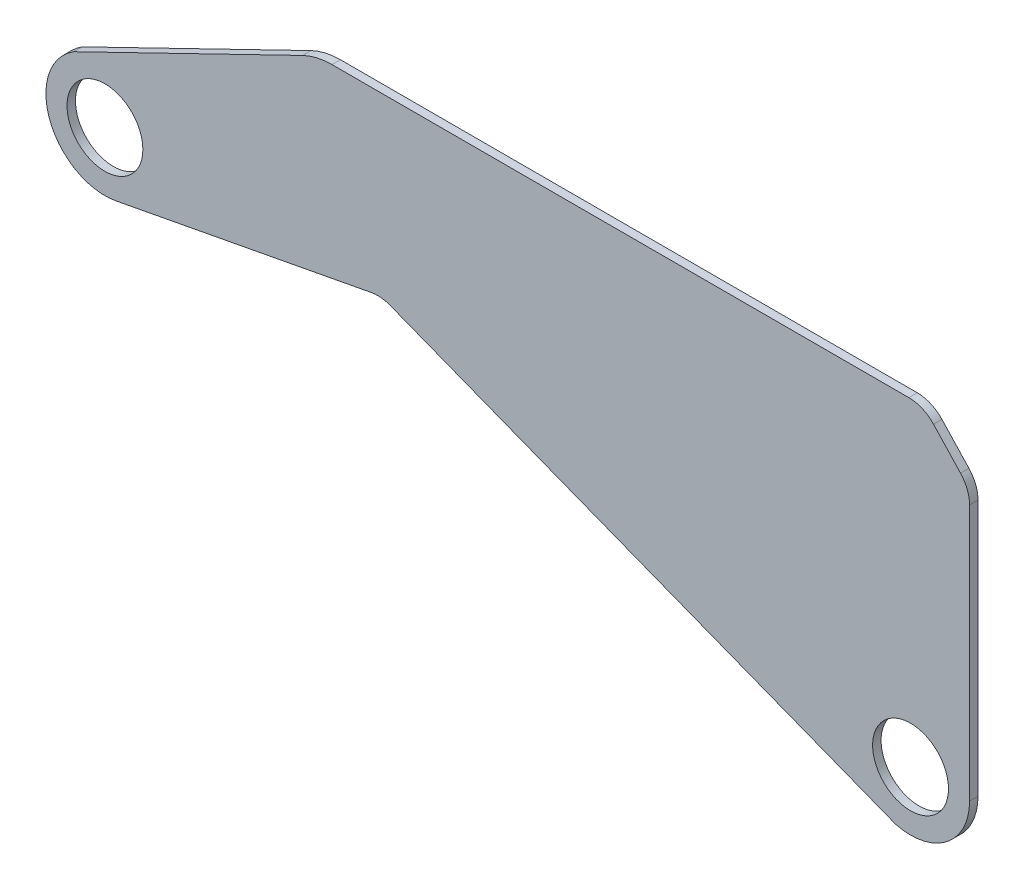
ISO-10303-21;
HEADER;
FILE_DESCRIPTION(('STEP AP214'),'2;1');
FILE_NAME('part.step','',(''),(''),'','','');
FILE_SCHEMA(('AUTOMOTIVE_DESIGN { 1 0 10303 214 1 1 1 1 }'));
ENDSEC;
DATA;
#1=APPLICATION_CONTEXT('core data for automotive mechanical design processes');
#2=APPLICATION_PROTOCOL_DEFINITION('international standard','automotive_design',2000,#1);
#3=PRODUCT_CONTEXT('',#1,'mechanical');
#4=PRODUCT('Part','Part','',(#3));
#5=PRODUCT_RELATED_PRODUCT_CATEGORY('part','',(#4));
#6=PRODUCT_DEFINITION_FORMATION('','',#4);
#7=PRODUCT_DEFINITION_CONTEXT('part definition',#1,'design');
#8=PRODUCT_DEFINITION('design','',#6,#7);
#9=PRODUCT_DEFINITION_SHAPE('','',#8);
#10=(LENGTH_UNIT() NAMED_UNIT(*) SI_UNIT(.MILLI.,.METRE.));
#11=(NAMED_UNIT(*) PLANE_ANGLE_UNIT() SI_UNIT($,.RADIAN.));
#12=(NAMED_UNIT(*) SI_UNIT($,.STERADIAN.) SOLID_ANGLE_UNIT());
#13=UNCERTAINTY_MEASURE_WITH_UNIT(LENGTH_MEASURE(1.E-05),#10,'distance_accuracy_value','');
#14=(GEOMETRIC_REPRESENTATION_CONTEXT(3) GLOBAL_UNCERTAINTY_ASSIGNED_CONTEXT((#13)) GLOBAL_UNIT_ASSIGNED_CONTEXT((#10,
#11,#12)) REPRESENTATION_CONTEXT('',''));
#15=CARTESIAN_POINT('',(0.,0.,0.));
#16=DIRECTION('',(0.,0.,1.));
#17=DIRECTION('',(1.,0.,0.));
#18=AXIS2_PLACEMENT_3D('',#15,#16,#17);
#19=CARTESIAN_POINT('',(-89.9470010414896,185.144778833084,3.175));
#20=DIRECTION('',(0.436980758194094,-0.899470853873607,0.));
#21=DIRECTION('',(0.899470853873607,0.436980758194094,0.));
#22=AXIS2_PLACEMENT_3D('',#19,#20,#21);
#23=PLANE('',#22);
#24=DIRECTION('',(-0.899470853873607,-0.436980758194094,0.));
#25=VECTOR('',#24,1.);
#26=CARTESIAN_POINT('',(-89.9470010414896,185.144778833084,3.175));
#27=LINE('',#26,#25);
#28=CARTESIAN_POINT('',(-228.976859545876,117.601319565641,3.175));
#29=VERTEX_POINT('',#28);
#30=CARTESIAN_POINT('',(-315.107157175411,75.7575148447312,3.175));
#31=VERTEX_POINT('',#30);
#32=EDGE_CURVE('E131',#29,#31,#27,.T.);
#33=ORIENTED_EDGE('',*,*,#32,.F.);
#34=DIRECTION('',(0.,0.,-1.));
#35=VECTOR('',#34,1.);
#36=CARTESIAN_POINT('',(-228.976859545876,117.601319565641,3.175));
#37=LINE('',#36,#35);
#38=CARTESIAN_POINT('',(-228.976859545876,117.601319565641,0.));
#39=VERTEX_POINT('',#38);
#40=EDGE_CURVE('E171',#29,#39,#37,.T.);
#41=ORIENTED_EDGE('',*,*,#40,.T.);
#42=DIRECTION('',(-0.899470853873607,-0.436980758194094,0.));
#43=VECTOR('',#42,1.);
#44=CARTESIAN_POINT('',(-89.9470010414896,185.144778833084,0.));
#45=LINE('',#44,#43);
#46=CARTESIAN_POINT('',(-315.107157175411,75.7575148447312,0.));
#47=VERTEX_POINT('',#46);
#48=EDGE_CURVE('E155',#39,#47,#45,.T.);
#49=ORIENTED_EDGE('',*,*,#48,.T.);
#50=DIRECTION('',(0.,0.,-1.));
#51=VECTOR('',#50,1.);
#52=CARTESIAN_POINT('',(-315.107157175411,75.7575148447312,3.175));
#53=LINE('',#52,#51);
#54=EDGE_CURVE('E148',#31,#47,#53,.T.);
#55=ORIENTED_EDGE('',*,*,#54,.F.);
#56=EDGE_LOOP('',(#33,#41,#49,#55));
#57=FACE_BOUND('',#56,.T.);
#58=ADVANCED_FACE('F43',(#57),#23,.F.);
#59=CARTESIAN_POINT('',(-303.430444421185,56.8470678839822,3.175));
#60=DIRECTION('',(0.,0.,-1.));
#61=DIRECTION('',(-1.,0.,0.));
#62=AXIS2_PLACEMENT_3D('',#59,#60,#61);
#63=CYLINDRICAL_SURFACE('',#62,22.225);
#64=CARTESIAN_POINT('',(-303.430444421185,56.8470678839822,0.));
#65=DIRECTION('',(0.,0.,1.));
#66=DIRECTION('',(1.,0.,0.));
#67=AXIS2_PLACEMENT_3D('',#64,#65,#66);
#68=CIRCLE('',#67,22.225);
#69=CARTESIAN_POINT('',(-299.298978098127,35.0094487138108,0.));
#70=VERTEX_POINT('',#69);
#71=EDGE_CURVE('E234',#47,#70,#68,.T.);
#72=ORIENTED_EDGE('',*,*,#71,.T.);
#73=DIRECTION('',(0.,0.,-1.));
#74=VECTOR('',#73,1.);
#75=CARTESIAN_POINT('',(-299.298978098127,35.0094487138108,3.175));
#76=LINE('',#75,#74);
#77=CARTESIAN_POINT('',(-299.298978098127,35.0094487138108,3.175));
#78=VERTEX_POINT('',#77);
#79=EDGE_CURVE('E150',#78,#70,#76,.T.);
#80=ORIENTED_EDGE('',*,*,#79,.F.);
#81=CARTESIAN_POINT('',(-303.430444421185,56.8470678839822,3.175));
#82=DIRECTION('',(0.,0.,1.));
#83=DIRECTION('',(1.,0.,0.));
#84=AXIS2_PLACEMENT_3D('',#81,#82,#83);
#85=CIRCLE('',#84,22.225);
#86=EDGE_CURVE('E135',#31,#78,#85,.T.);
#87=ORIENTED_EDGE('',*,*,#86,.F.);
#88=ORIENTED_EDGE('',*,*,#54,.T.);
#89=EDGE_LOOP('',(#72,#80,#87,#88));
#90=FACE_BOUND('',#89,.T.);
#91=ADVANCED_FACE('F147',(#90),#63,.T.);
#92=CARTESIAN_POINT('',(-16.7371779379957,88.4674082306973,3.175));
#93=DIRECTION('',(-0.185892747944114,0.982570041402538,0.));
#94=DIRECTION('',(-0.982570041402539,-0.185892747944114,0.));
#95=AXIS2_PLACEMENT_3D('',#92,#93,#94);
#96=PLANE('',#95);
#97=DIRECTION('',(0.982570041402538,0.185892747944114,0.));
#98=VECTOR('',#97,1.);
#99=CARTESIAN_POINT('',(-16.7371779379957,88.4674082306973,0.));
#100=LINE('',#99,#98);
#101=CARTESIAN_POINT('',(-203.043765649032,53.2200038825454,0.));
#102=VERTEX_POINT('',#101);
#103=EDGE_CURVE('E229',#70,#102,#100,.T.);
#104=ORIENTED_EDGE('',*,*,#103,.T.);
#105=DIRECTION('',(0.,0.,-1.));
#106=VECTOR('',#105,1.);
#107=CARTESIAN_POINT('',(-203.043765649032,53.2200038825454,3.175));
#108=LINE('',#107,#106);
#109=CARTESIAN_POINT('',(-203.043765649032,53.2200038825454,3.175));
#110=VERTEX_POINT('',#109);
#111=EDGE_CURVE('E160',#102,#110,#108,.F.);
#112=ORIENTED_EDGE('',*,*,#111,.T.);
#113=DIRECTION('',(0.982570041402538,0.185892747944114,0.));
#114=VECTOR('',#113,1.);
#115=CARTESIAN_POINT('',(-16.7371779379957,88.4674082306973,3.175));
#116=LINE('',#115,#114);
#117=EDGE_CURVE('E152',#78,#110,#116,.T.);
#118=ORIENTED_EDGE('',*,*,#117,.F.);
#119=ORIENTED_EDGE('',*,*,#79,.T.);
#120=EDGE_LOOP('',(#104,#112,#118,#119));
#121=FACE_BOUND('',#120,.T.);
#122=ADVANCED_FACE('F279',(#121),#96,.F.);
#123=CARTESIAN_POINT('',(-7.99746861236985,-20.565009118134,3.175));
#124=DIRECTION('',(0.362444885945906,0.932005206343644,0.));
#125=DIRECTION('',(-0.932005206343644,0.362444885945906,0.));
#126=AXIS2_PLACEMENT_3D('',#123,#124,#125);
#127=PLANE('',#126);
#128=DIRECTION('',(0.932005206343644,-0.362444885945906,0.));
#129=VECTOR('',#128,1.);
#130=CARTESIAN_POINT('',(-7.99746861236985,-20.565009118134,3.175));
#131=LINE('',#130,#129);
#132=CARTESIAN_POINT('',(-196.079877698628,52.5778304772975,3.175));
#133=VERTEX_POINT('',#132);
#134=CARTESIAN_POINT('',(-5.51904950337745,-21.5288345615658,3.175));
#135=VERTEX_POINT('',#134);
#136=EDGE_CURVE('E250',#133,#135,#131,.T.);
#137=ORIENTED_EDGE('',*,*,#136,.F.);
#138=DIRECTION('',(0.,0.,-1.));
#139=VECTOR('',#138,1.);
#140=CARTESIAN_POINT('',(-196.079877698628,52.5778304772975,0.));
#141=LINE('',#140,#139);
#142=CARTESIAN_POINT('',(-196.079877698628,52.5778304772975,0.));
#143=VERTEX_POINT('',#142);
#144=EDGE_CURVE('E157',#133,#143,#141,.T.);
#145=ORIENTED_EDGE('',*,*,#144,.T.);
#146=DIRECTION('',(0.932005206343644,-0.362444885945906,0.));
#147=VECTOR('',#146,1.);
#148=CARTESIAN_POINT('',(-7.99746861236985,-20.565009118134,0.));
#149=LINE('',#148,#147);
#150=CARTESIAN_POINT('',(-5.51904950337745,-21.5288345615658,0.));
#151=VERTEX_POINT('',#150);
#152=EDGE_CURVE('E226',#143,#151,#149,.T.);
#153=ORIENTED_EDGE('',*,*,#152,.T.);
#154=DIRECTION('',(0.,0.,-1.));
#155=VECTOR('',#154,1.);
#156=CARTESIAN_POINT('',(-5.51904950337745,-21.5288345615658,3.175));
#157=LINE('',#156,#155);
#158=EDGE_CURVE('E162',#135,#151,#157,.T.);
#159=ORIENTED_EDGE('',*,*,#158,.F.);
#160=EDGE_LOOP('',(#137,#145,#153,#159));
#161=FACE_BOUND('',#160,.T.);
#162=ADVANCED_FACE('F312',(#161),#127,.F.);
#163=CARTESIAN_POINT('',(0.,0.,3.175));
#164=DIRECTION('',(0.,0.,-1.));
#165=DIRECTION('',(-1.,0.,0.));
#166=AXIS2_PLACEMENT_3D('',#163,#164,#165);
#167=CYLINDRICAL_SURFACE('',#166,22.225);
#168=CARTESIAN_POINT('',(0.,0.,0.));
#169=DIRECTION('',(0.,0.,1.));
#170=DIRECTION('',(1.,0.,0.));
#171=AXIS2_PLACEMENT_3D('',#168,#169,#170);
#172=CIRCLE('',#171,22.225);
#173=CARTESIAN_POINT('',(22.225,0.,0.));
#174=VERTEX_POINT('',#173);
#175=EDGE_CURVE('E220',#151,#174,#172,.T.);
#176=ORIENTED_EDGE('',*,*,#175,.T.);
#177=DIRECTION('',(0.,0.,-1.));
#178=VECTOR('',#177,1.);
#179=CARTESIAN_POINT('',(22.225,0.,3.175));
#180=LINE('',#179,#178);
#181=CARTESIAN_POINT('',(22.225,0.,3.175));
#182=VERTEX_POINT('',#181);
#183=EDGE_CURVE('E211',#182,#174,#180,.T.);
#184=ORIENTED_EDGE('',*,*,#183,.F.);
#185=CARTESIAN_POINT('',(0.,0.,3.175));
#186=DIRECTION('',(0.,0.,1.));
#187=DIRECTION('',(1.,0.,0.));
#188=AXIS2_PLACEMENT_3D('',#185,#186,#187);
#189=CIRCLE('',#188,22.225);
#190=EDGE_CURVE('E221',#135,#182,#189,.T.);
#191=ORIENTED_EDGE('',*,*,#190,.F.);
#192=ORIENTED_EDGE('',*,*,#158,.T.);
#193=EDGE_LOOP('',(#176,#184,#191,#192));
#194=FACE_BOUND('',#193,.T.);
#195=ADVANCED_FACE('F218',(#194),#167,.T.);
#196=CARTESIAN_POINT('',(22.225,0.,3.175));
#197=DIRECTION('',(-1.,0.,0.));
#198=DIRECTION('',(0.,-1.,0.));
#199=AXIS2_PLACEMENT_3D('',#196,#197,#198);
#200=PLANE('',#199);
#201=DIRECTION('',(0.,1.,0.));
#202=VECTOR('',#201,1.);
#203=CARTESIAN_POINT('',(22.225,0.,0.));
#204=LINE('',#203,#202);
#205=CARTESIAN_POINT('',(22.225,96.5881841108285,0.));
#206=VERTEX_POINT('',#205);
#207=EDGE_CURVE('E207',#174,#206,#204,.T.);
#208=ORIENTED_EDGE('',*,*,#207,.T.);
#209=DIRECTION('',(0.,0.,-1.));
#210=VECTOR('',#209,1.);
#211=CARTESIAN_POINT('',(22.225,96.5881841108285,3.175));
#212=LINE('',#211,#210);
#213=CARTESIAN_POINT('',(22.225,96.5881841108285,3.175));
#214=VERTEX_POINT('',#213);
#215=EDGE_CURVE('E185',#206,#214,#212,.F.);
#216=ORIENTED_EDGE('',*,*,#215,.T.);
#217=DIRECTION('',(0.,1.,0.));
#218=VECTOR('',#217,1.);
#219=CARTESIAN_POINT('',(22.225,0.,3.175));
#220=LINE('',#219,#218);
#221=EDGE_CURVE('E246',#182,#214,#220,.T.);
#222=ORIENTED_EDGE('',*,*,#221,.F.);
#223=ORIENTED_EDGE('',*,*,#183,.T.);
#224=EDGE_LOOP('',(#208,#216,#222,#223));
#225=FACE_BOUND('',#224,.T.);
#226=ADVANCED_FACE('F306',(#225),#200,.F.);
#227=CARTESIAN_POINT('',(62.5449460437425,58.4701466874838,3.175));
#228=DIRECTION('',(-0.730502357372089,-0.682910174088672,0.));
#229=DIRECTION('',(0.682910174088672,-0.730502357372089,0.));
#230=AXIS2_PLACEMENT_3D('',#227,#228,#229);
#231=PLANE('',#230);
#232=DIRECTION('',(-0.682910174088672,0.730502357372089,0.));
#233=VECTOR('',#232,1.);
#234=CARTESIAN_POINT('',(62.5449460437425,58.4701466874838,0.));
#235=LINE('',#234,#233);
#236=CARTESIAN_POINT('',(18.8023799386255,105.261143321755,0.));
#237=VERTEX_POINT('',#236);
#238=CARTESIAN_POINT('',(8.64376090953531,116.127719088177,0.));
#239=VERTEX_POINT('',#238);
#240=EDGE_CURVE('E203',#237,#239,#235,.T.);
#241=ORIENTED_EDGE('',*,*,#240,.T.);
#242=DIRECTION('',(0.,0.,-1.));
#243=VECTOR('',#242,1.);
#244=CARTESIAN_POINT('',(8.64376090953532,116.127719088177,3.175));
#245=LINE('',#244,#243);
#246=CARTESIAN_POINT('',(8.64376090953531,116.127719088177,3.175));
#247=VERTEX_POINT('',#246);
#248=EDGE_CURVE('E51',#239,#247,#245,.F.);
#249=ORIENTED_EDGE('',*,*,#248,.T.);
#250=DIRECTION('',(-0.682910174088672,0.730502357372089,0.));
#251=VECTOR('',#250,1.);
#252=CARTESIAN_POINT('',(62.5449460437425,58.4701466874838,3.175));
#253=LINE('',#252,#251);
#254=CARTESIAN_POINT('',(18.8023799386255,105.261143321755,3.175));
#255=VERTEX_POINT('',#254);
#256=EDGE_CURVE('E244',#255,#247,#253,.T.);
#257=ORIENTED_EDGE('',*,*,#256,.F.);
#258=DIRECTION('',(0.,0.,-1.));
#259=VECTOR('',#258,1.);
#260=CARTESIAN_POINT('',(18.8023799386255,105.261143321755,3.175));
#261=LINE('',#260,#259);
#262=EDGE_CURVE('E180',#255,#237,#261,.T.);
#263=ORIENTED_EDGE('',*,*,#262,.T.);
#264=EDGE_LOOP('',(#241,#249,#257,#263));
#265=FACE_BOUND('',#264,.T.);
#266=ADVANCED_FACE('F285',(#265),#231,.F.);
#267=CARTESIAN_POINT('',(0.,0.,3.175));
#268=DIRECTION('',(0.,0.,-1.));
#269=DIRECTION('',(-1.,0.,0.));
#270=AXIS2_PLACEMENT_3D('',#267,#268,#269);
#271=CYLINDRICAL_SURFACE('',#270,14.2875);
#272=CARTESIAN_POINT('',(0.,0.,3.175));
#273=DIRECTION('',(0.,0.,1.));
#274=DIRECTION('',(1.,0.,0.));
#275=AXIS2_PLACEMENT_3D('',#272,#273,#274);
#276=CIRCLE('',#275,14.2875);
#277=CARTESIAN_POINT('',(14.2875,0.,3.175));
#278=VERTEX_POINT('',#277);
#279=EDGE_CURVE('E143',#278,#278,#276,.T.);
#280=ORIENTED_EDGE('',*,*,#279,.T.);
#281=EDGE_LOOP('',(#280));
#282=FACE_BOUND('',#281,.T.);
#283=CARTESIAN_POINT('',(0.,0.,0.));
#284=DIRECTION('',(0.,0.,1.));
#285=DIRECTION('',(1.,0.,0.));
#286=AXIS2_PLACEMENT_3D('',#283,#284,#285);
#287=CIRCLE('',#286,14.2875);
#288=CARTESIAN_POINT('',(14.2875,0.,0.));
#289=VERTEX_POINT('',#288);
#290=EDGE_CURVE('E237',#289,#289,#287,.T.);
#291=ORIENTED_EDGE('',*,*,#290,.F.);
#292=EDGE_LOOP('',(#291));
#293=FACE_BOUND('',#292,.T.);
#294=ADVANCED_FACE('F256',(#282,#293),#271,.F.);
#295=CARTESIAN_POINT('',(-303.430444421185,56.8470678839822,3.175));
#296=DIRECTION('',(0.,0.,-1.));
#297=DIRECTION('',(-1.,0.,0.));
#298=AXIS2_PLACEMENT_3D('',#295,#296,#297);
#299=CYLINDRICAL_SURFACE('',#298,14.2875);
#300=CARTESIAN_POINT('',(-303.430444421185,56.8470678839822,3.175));
#301=DIRECTION('',(0.,0.,1.));
#302=DIRECTION('',(1.,0.,0.));
#303=AXIS2_PLACEMENT_3D('',#300,#301,#302);
#304=CIRCLE('',#303,14.2875);
#305=CARTESIAN_POINT('',(-289.142944421185,56.8470678839822,3.175));
#306=VERTEX_POINT('',#305);
#307=EDGE_CURVE('E202',#306,#306,#304,.T.);
#308=ORIENTED_EDGE('',*,*,#307,.T.);
#309=EDGE_LOOP('',(#308));
#310=FACE_BOUND('',#309,.T.);
#311=CARTESIAN_POINT('',(-303.430444421185,56.8470678839822,0.));
#312=DIRECTION('',(0.,0.,1.));
#313=DIRECTION('',(1.,0.,0.));
#314=AXIS2_PLACEMENT_3D('',#311,#312,#313);
#315=CIRCLE('',#314,14.2875);
#316=CARTESIAN_POINT('',(-289.142944421185,56.8470678839822,0.));
#317=VERTEX_POINT('',#316);
#318=EDGE_CURVE('E240',#317,#317,#315,.T.);
#319=ORIENTED_EDGE('',*,*,#318,.F.);
#320=EDGE_LOOP('',(#319));
#321=FACE_BOUND('',#320,.T.);
#322=ADVANCED_FACE('F269',(#310,#321),#299,.F.);
#323=CARTESIAN_POINT('',(0.,120.154759877251,3.175));
#324=DIRECTION('',(0.,-1.,0.));
#325=DIRECTION('',(0.,0.,-1.));
#326=AXIS2_PLACEMENT_3D('',#323,#324,#325);
#327=PLANE('',#326);
#328=DIRECTION('',(-1.,0.,0.));
#329=VECTOR('',#328,1.);
#330=CARTESIAN_POINT('',(0.,120.154759877251,3.175));
#331=LINE('',#330,#329);
#332=CARTESIAN_POINT('',(-0.633619029090221,120.154759877251,3.175));
#333=VERTEX_POINT('',#332);
#334=CARTESIAN_POINT('',(-217.877548287746,120.154759877251,3.175));
#335=VERTEX_POINT('',#334);
#336=EDGE_CURVE('E197',#333,#335,#331,.T.);
#337=ORIENTED_EDGE('',*,*,#336,.F.);
#338=DIRECTION('',(0.,0.,-1.));
#339=VECTOR('',#338,1.);
#340=CARTESIAN_POINT('',(-0.633619029090221,120.154759877251,3.175));
#341=LINE('',#340,#339);
#342=CARTESIAN_POINT('',(-0.633619029090221,120.154759877251,0.));
#343=VERTEX_POINT('',#342);
#344=EDGE_CURVE('E189',#333,#343,#341,.T.);
#345=ORIENTED_EDGE('',*,*,#344,.T.);
#346=DIRECTION('',(-1.,0.,0.));
#347=VECTOR('',#346,1.);
#348=CARTESIAN_POINT('',(0.,120.154759877251,0.));
#349=LINE('',#348,#347);
#350=CARTESIAN_POINT('',(-217.877548287746,120.154759877251,0.));
#351=VERTEX_POINT('',#350);
#352=EDGE_CURVE('E196',#343,#351,#349,.T.);
#353=ORIENTED_EDGE('',*,*,#352,.T.);
#354=DIRECTION('',(0.,0.,-1.));
#355=VECTOR('',#354,1.);
#356=CARTESIAN_POINT('',(-217.877548287746,120.154759877251,3.175));
#357=LINE('',#356,#355);
#358=EDGE_CURVE('E176',#351,#335,#357,.F.);
#359=ORIENTED_EDGE('',*,*,#358,.T.);
#360=EDGE_LOOP('',(#337,#345,#353,#359));
#361=FACE_BOUND('',#360,.T.);
#362=ADVANCED_FACE('F195',(#361),#327,.F.);
#363=CARTESIAN_POINT('',(0.,0.,3.175));
#364=DIRECTION('',(0.,0.,1.));
#365=DIRECTION('',(1.,0.,0.));
#366=AXIS2_PLACEMENT_3D('',#363,#364,#365);
#367=PLANE('',#366);
#368=ORIENTED_EDGE('',*,*,#307,.F.);
#369=EDGE_LOOP('',(#368));
#370=FACE_BOUND('',#369,.T.);
#371=ORIENTED_EDGE('',*,*,#279,.F.);
#372=EDGE_LOOP('',(#371));
#373=FACE_BOUND('',#372,.T.);
#374=ORIENTED_EDGE('',*,*,#256,.T.);
#375=CARTESIAN_POINT('',(-0.633619029090221,107.454759877251,3.175));
#376=DIRECTION('',(0.,0.,1.));
#377=DIRECTION('',(1.,0.,0.));
#378=AXIS2_PLACEMENT_3D('',#375,#376,#377);
#379=CIRCLE('',#378,12.7);
#380=EDGE_CURVE('E11',#247,#333,#379,.T.);
#381=ORIENTED_EDGE('',*,*,#380,.T.);
#382=ORIENTED_EDGE('',*,*,#336,.T.);
#383=CARTESIAN_POINT('',(-217.877548287746,94.7547598772511,3.175));
#384=DIRECTION('',(0.,0.,1.));
#385=DIRECTION('',(1.,0.,0.));
#386=AXIS2_PLACEMENT_3D('',#383,#384,#385);
#387=CIRCLE('',#386,25.4);
#388=EDGE_CURVE('E138',#335,#29,#387,.T.);
#389=ORIENTED_EDGE('',*,*,#388,.T.);
#390=ORIENTED_EDGE('',*,*,#32,.T.);
#391=ORIENTED_EDGE('',*,*,#86,.T.);
#392=ORIENTED_EDGE('',*,*,#117,.T.);
#393=CARTESIAN_POINT('',(-200.682927750141,40.7413643567332,3.175));
#394=DIRECTION('',(0.,0.,1.));
#395=DIRECTION('',(1.,0.,0.));
#396=AXIS2_PLACEMENT_3D('',#393,#394,#395);
#397=CIRCLE('',#396,12.7);
#398=EDGE_CURVE('E169',#110,#133,#397,.F.);
#399=ORIENTED_EDGE('',*,*,#398,.T.);
#400=ORIENTED_EDGE('',*,*,#136,.T.);
#401=ORIENTED_EDGE('',*,*,#190,.T.);
#402=ORIENTED_EDGE('',*,*,#221,.T.);
#403=CARTESIAN_POINT('',(9.525,96.5881841108285,3.175));
#404=DIRECTION('',(0.,0.,1.));
#405=DIRECTION('',(1.,0.,0.));
#406=AXIS2_PLACEMENT_3D('',#403,#404,#405);
#407=CIRCLE('',#406,12.7);
#408=EDGE_CURVE('E187',#214,#255,#407,.T.);
#409=ORIENTED_EDGE('',*,*,#408,.T.);
#410=EDGE_LOOP('',(#374,#381,#382,#389,#390,#391,#392,#399,#400,#401,#402,#409));
#411=FACE_BOUND('',#410,.T.);
#412=ADVANCED_FACE('F133',(#370,#373,#411),#367,.T.);
#413=CARTESIAN_POINT('',(0.,0.,0.));
#414=DIRECTION('',(0.,0.,1.));
#415=DIRECTION('',(1.,0.,0.));
#416=AXIS2_PLACEMENT_3D('',#413,#414,#415);
#417=PLANE('',#416);
#418=ORIENTED_EDGE('',*,*,#318,.T.);
#419=EDGE_LOOP('',(#418));
#420=FACE_BOUND('',#419,.T.);
#421=ORIENTED_EDGE('',*,*,#290,.T.);
#422=EDGE_LOOP('',(#421));
#423=FACE_BOUND('',#422,.T.);
#424=ORIENTED_EDGE('',*,*,#352,.F.);
#425=CARTESIAN_POINT('',(-0.633619029090221,107.454759877251,0.));
#426=DIRECTION('',(0.,0.,1.));
#427=DIRECTION('',(1.,0.,0.));
#428=AXIS2_PLACEMENT_3D('',#425,#426,#427);
#429=CIRCLE('',#428,12.7);
#430=EDGE_CURVE('E65',#343,#239,#429,.F.);
#431=ORIENTED_EDGE('',*,*,#430,.T.);
#432=ORIENTED_EDGE('',*,*,#240,.F.);
#433=CARTESIAN_POINT('',(9.525,96.5881841108285,0.));
#434=DIRECTION('',(0.,0.,1.));
#435=DIRECTION('',(1.,0.,0.));
#436=AXIS2_PLACEMENT_3D('',#433,#434,#435);
#437=CIRCLE('',#436,12.7);
#438=EDGE_CURVE('E183',#237,#206,#437,.F.);
#439=ORIENTED_EDGE('',*,*,#438,.T.);
#440=ORIENTED_EDGE('',*,*,#207,.F.);
#441=ORIENTED_EDGE('',*,*,#175,.F.);
#442=ORIENTED_EDGE('',*,*,#152,.F.);
#443=CARTESIAN_POINT('',(-200.682927750141,40.7413643567332,0.));
#444=DIRECTION('',(0.,0.,1.));
#445=DIRECTION('',(1.,0.,0.));
#446=AXIS2_PLACEMENT_3D('',#443,#444,#445);
#447=CIRCLE('',#446,12.7);
#448=EDGE_CURVE('E167',#143,#102,#447,.T.);
#449=ORIENTED_EDGE('',*,*,#448,.T.);
#450=ORIENTED_EDGE('',*,*,#103,.F.);
#451=ORIENTED_EDGE('',*,*,#71,.F.);
#452=ORIENTED_EDGE('',*,*,#48,.F.);
#453=CARTESIAN_POINT('',(-217.877548287746,94.7547598772511,0.));
#454=DIRECTION('',(0.,0.,1.));
#455=DIRECTION('',(1.,0.,0.));
#456=AXIS2_PLACEMENT_3D('',#453,#454,#455);
#457=CIRCLE('',#456,25.4);
#458=EDGE_CURVE('E173',#39,#351,#457,.F.);
#459=ORIENTED_EDGE('',*,*,#458,.T.);
#460=EDGE_LOOP('',(#424,#431,#432,#439,#440,#441,#442,#449,#450,#451,#452,#459));
#461=FACE_BOUND('',#460,.T.);
#462=ADVANCED_FACE('F200',(#420,#423,#461),#417,.F.);
#463=CARTESIAN_POINT('',(-200.682927750141,40.7413643567332,3.175));
#464=DIRECTION('',(0.,0.,1.));
#465=DIRECTION('',(1.,0.,0.));
#466=AXIS2_PLACEMENT_3D('',#463,#464,#465);
#467=CYLINDRICAL_SURFACE('',#466,12.7);
#468=ORIENTED_EDGE('',*,*,#398,.F.);
#469=ORIENTED_EDGE('',*,*,#111,.F.);
#470=ORIENTED_EDGE('',*,*,#448,.F.);
#471=ORIENTED_EDGE('',*,*,#144,.F.);
#472=EDGE_LOOP('',(#468,#469,#470,#471));
#473=FACE_BOUND('',#472,.T.);
#474=ADVANCED_FACE('F266',(#473),#467,.F.);
#475=CARTESIAN_POINT('',(-217.877548287746,94.7547598772511,3.175));
#476=DIRECTION('',(0.,0.,-1.));
#477=DIRECTION('',(-1.,0.,0.));
#478=AXIS2_PLACEMENT_3D('',#475,#476,#477);
#479=CYLINDRICAL_SURFACE('',#478,25.4);
#480=ORIENTED_EDGE('',*,*,#388,.F.);
#481=ORIENTED_EDGE('',*,*,#358,.F.);
#482=ORIENTED_EDGE('',*,*,#458,.F.);
#483=ORIENTED_EDGE('',*,*,#40,.F.);
#484=EDGE_LOOP('',(#480,#481,#482,#483));
#485=FACE_BOUND('',#484,.T.);
#486=ADVANCED_FACE('F290',(#485),#479,.T.);
#487=CARTESIAN_POINT('',(9.525,96.5881841108285,3.175));
#488=DIRECTION('',(0.,0.,-1.));
#489=DIRECTION('',(-1.,0.,0.));
#490=AXIS2_PLACEMENT_3D('',#487,#488,#489);
#491=CYLINDRICAL_SURFACE('',#490,12.7);
#492=ORIENTED_EDGE('',*,*,#408,.F.);
#493=ORIENTED_EDGE('',*,*,#215,.F.);
#494=ORIENTED_EDGE('',*,*,#438,.F.);
#495=ORIENTED_EDGE('',*,*,#262,.F.);
#496=EDGE_LOOP('',(#492,#493,#494,#495));
#497=FACE_BOUND('',#496,.T.);
#498=ADVANCED_FACE('F292',(#497),#491,.T.);
#499=CARTESIAN_POINT('',(-0.633619029090221,107.454759877251,3.175));
#500=DIRECTION('',(0.,0.,-1.));
#501=DIRECTION('',(-1.,0.,0.));
#502=AXIS2_PLACEMENT_3D('',#499,#500,#501);
#503=CYLINDRICAL_SURFACE('',#502,12.7);
#504=ORIENTED_EDGE('',*,*,#380,.F.);
#505=ORIENTED_EDGE('',*,*,#248,.F.);
#506=ORIENTED_EDGE('',*,*,#430,.F.);
#507=ORIENTED_EDGE('',*,*,#344,.F.);
#508=EDGE_LOOP('',(#504,#505,#506,#507));
#509=FACE_BOUND('',#508,.T.);
#510=ADVANCED_FACE('F45',(#509),#503,.T.);
#511=CLOSED_SHELL('',(#58,#91,#122,#162,#195,#226,#266,#294,#322,#362,#412,#462,#474,#486,#498,#510));
#512=MANIFOLD_SOLID_BREP('B2',#511);
#513=ADVANCED_BREP_SHAPE_REPRESENTATION('',(#18,#512),#14);
#514=SHAPE_DEFINITION_REPRESENTATION(#9,#513);
ENDSEC;
END-ISO-10303-21;
